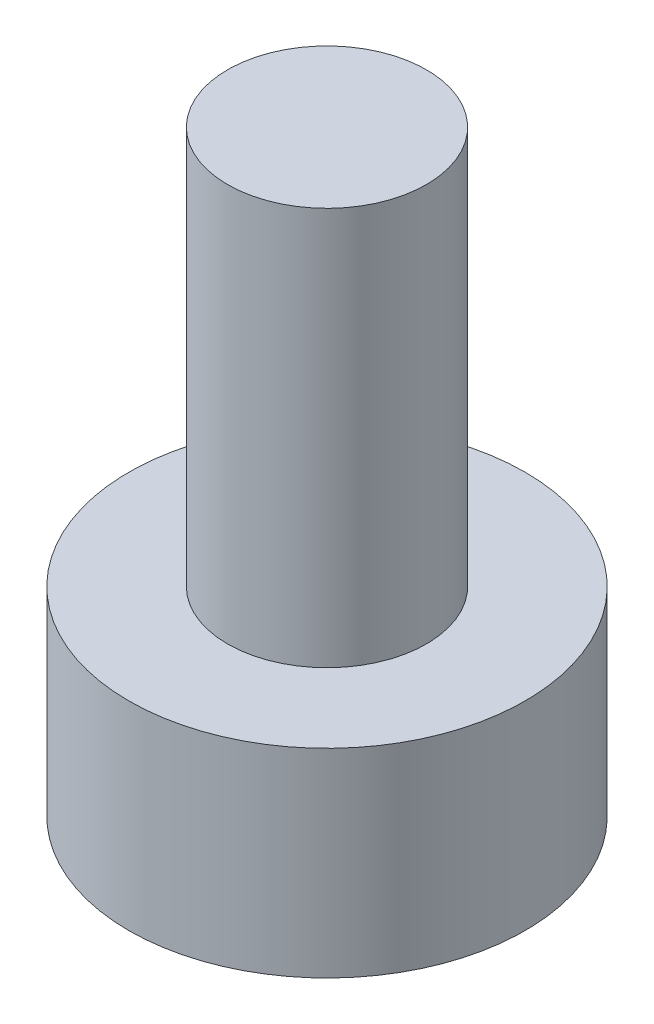
ISO-10303-21;
HEADER;
FILE_DESCRIPTION(('STEP AP214'),'2;1');
FILE_NAME('part.step','',(''),(''),'','','');
FILE_SCHEMA(('AUTOMOTIVE_DESIGN { 1 0 10303 214 1 1 1 1 }'));
ENDSEC;
DATA;
#1=APPLICATION_CONTEXT('core data for automotive mechanical design processes');
#2=APPLICATION_PROTOCOL_DEFINITION('international standard','automotive_design',2000,#1);
#3=PRODUCT_CONTEXT('',#1,'mechanical');
#4=PRODUCT('Part','Part','',(#3));
#5=PRODUCT_RELATED_PRODUCT_CATEGORY('part','',(#4));
#6=PRODUCT_DEFINITION_FORMATION('','',#4);
#7=PRODUCT_DEFINITION_CONTEXT('part definition',#1,'design');
#8=PRODUCT_DEFINITION('design','',#6,#7);
#9=PRODUCT_DEFINITION_SHAPE('','',#8);
#10=(LENGTH_UNIT() NAMED_UNIT(*) SI_UNIT(.MILLI.,.METRE.));
#11=(NAMED_UNIT(*) PLANE_ANGLE_UNIT() SI_UNIT($,.RADIAN.));
#12=(NAMED_UNIT(*) SI_UNIT($,.STERADIAN.) SOLID_ANGLE_UNIT());
#13=UNCERTAINTY_MEASURE_WITH_UNIT(LENGTH_MEASURE(1.E-05),#10,'distance_accuracy_value','');
#14=(GEOMETRIC_REPRESENTATION_CONTEXT(3) GLOBAL_UNCERTAINTY_ASSIGNED_CONTEXT((#13)) GLOBAL_UNIT_ASSIGNED_CONTEXT((#10,
#11,#12)) REPRESENTATION_CONTEXT('',''));
#15=CARTESIAN_POINT('',(0.,0.,0.));
#16=DIRECTION('',(0.,0.,1.));
#17=DIRECTION('',(1.,0.,0.));
#18=AXIS2_PLACEMENT_3D('',#15,#16,#17);
#19=CARTESIAN_POINT('',(0.,5.,0.));
#20=DIRECTION('',(0.,-1.,0.));
#21=DIRECTION('',(0.,0.,-1.));
#22=AXIS2_PLACEMENT_3D('',#19,#20,#21);
#23=CYLINDRICAL_SURFACE('',#22,4.98);
#24=CARTESIAN_POINT('',(0.,5.,0.));
#25=DIRECTION('',(0.,1.,0.));
#26=DIRECTION('',(0.,0.,1.));
#27=AXIS2_PLACEMENT_3D('',#24,#25,#26);
#28=CIRCLE('',#27,4.98);
#29=CARTESIAN_POINT('',(0.,5.,4.98));
#30=VERTEX_POINT('',#29);
#31=EDGE_CURVE('E38',#30,#30,#28,.T.);
#32=ORIENTED_EDGE('',*,*,#31,.F.);
#33=EDGE_LOOP('',(#32));
#34=FACE_BOUND('',#33,.T.);
#35=CARTESIAN_POINT('',(0.,0.,0.));
#36=DIRECTION('',(0.,1.,0.));
#37=DIRECTION('',(0.,0.,1.));
#38=AXIS2_PLACEMENT_3D('',#35,#36,#37);
#39=CIRCLE('',#38,4.98);
#40=CARTESIAN_POINT('',(0.,0.,4.98));
#41=VERTEX_POINT('',#40);
#42=EDGE_CURVE('E34',#41,#41,#39,.T.);
#43=ORIENTED_EDGE('',*,*,#42,.T.);
#44=EDGE_LOOP('',(#43));
#45=FACE_BOUND('',#44,.T.);
#46=ADVANCED_FACE('F31',(#34,#45),#23,.T.);
#47=CARTESIAN_POINT('',(0.,5.,0.));
#48=DIRECTION('',(0.,1.,0.));
#49=DIRECTION('',(0.,0.,1.));
#50=AXIS2_PLACEMENT_3D('',#47,#48,#49);
#51=PLANE('',#50);
#52=CARTESIAN_POINT('',(0.,5.,0.));
#53=DIRECTION('',(0.,1.,0.));
#54=DIRECTION('',(0.,0.,1.));
#55=AXIS2_PLACEMENT_3D('',#52,#53,#54);
#56=CIRCLE('',#55,2.5);
#57=CARTESIAN_POINT('',(0.,5.,2.5));
#58=VERTEX_POINT('',#57);
#59=EDGE_CURVE('E10',#58,#58,#56,.T.);
#60=ORIENTED_EDGE('',*,*,#59,.F.);
#61=EDGE_LOOP('',(#60));
#62=FACE_BOUND('',#61,.T.);
#63=ORIENTED_EDGE('',*,*,#31,.T.);
#64=EDGE_LOOP('',(#63));
#65=FACE_BOUND('',#64,.T.);
#66=ADVANCED_FACE('F55',(#62,#65),#51,.T.);
#67=CARTESIAN_POINT('',(0.,0.,0.));
#68=DIRECTION('',(0.,1.,0.));
#69=DIRECTION('',(0.,0.,1.));
#70=AXIS2_PLACEMENT_3D('',#67,#68,#69);
#71=PLANE('',#70);
#72=ORIENTED_EDGE('',*,*,#42,.F.);
#73=EDGE_LOOP('',(#72));
#74=FACE_BOUND('',#73,.T.);
#75=ADVANCED_FACE('F52',(#74),#71,.F.);
#76=CARTESIAN_POINT('',(0.,15.,0.));
#77=DIRECTION('',(0.,-1.,0.));
#78=DIRECTION('',(0.,0.,-1.));
#79=AXIS2_PLACEMENT_3D('',#76,#77,#78);
#80=CYLINDRICAL_SURFACE('',#79,2.5);
#81=CARTESIAN_POINT('',(0.,15.,0.));
#82=DIRECTION('',(0.,1.,0.));
#83=DIRECTION('',(0.,0.,1.));
#84=AXIS2_PLACEMENT_3D('',#81,#82,#83);
#85=CIRCLE('',#84,2.5);
#86=CARTESIAN_POINT('',(0.,15.,2.5));
#87=VERTEX_POINT('',#86);
#88=EDGE_CURVE('E44',#87,#87,#85,.T.);
#89=ORIENTED_EDGE('',*,*,#88,.F.);
#90=EDGE_LOOP('',(#89));
#91=FACE_BOUND('',#90,.T.);
#92=ORIENTED_EDGE('',*,*,#59,.T.);
#93=EDGE_LOOP('',(#92));
#94=FACE_BOUND('',#93,.T.);
#95=ADVANCED_FACE('F54',(#91,#94),#80,.T.);
#96=CARTESIAN_POINT('',(0.,15.,0.));
#97=DIRECTION('',(0.,1.,0.));
#98=DIRECTION('',(0.,0.,1.));
#99=AXIS2_PLACEMENT_3D('',#96,#97,#98);
#100=PLANE('',#99);
#101=ORIENTED_EDGE('',*,*,#88,.T.);
#102=EDGE_LOOP('',(#101));
#103=FACE_BOUND('',#102,.T.);
#104=ADVANCED_FACE('F60',(#103),#100,.T.);
#105=CLOSED_SHELL('',(#46,#66,#75,#95,#104));
#106=MANIFOLD_SOLID_BREP('B2',#105);
#107=ADVANCED_BREP_SHAPE_REPRESENTATION('',(#18,#106),#14);
#108=SHAPE_DEFINITION_REPRESENTATION(#9,#107);
ENDSEC;
END-ISO-10303-21;
